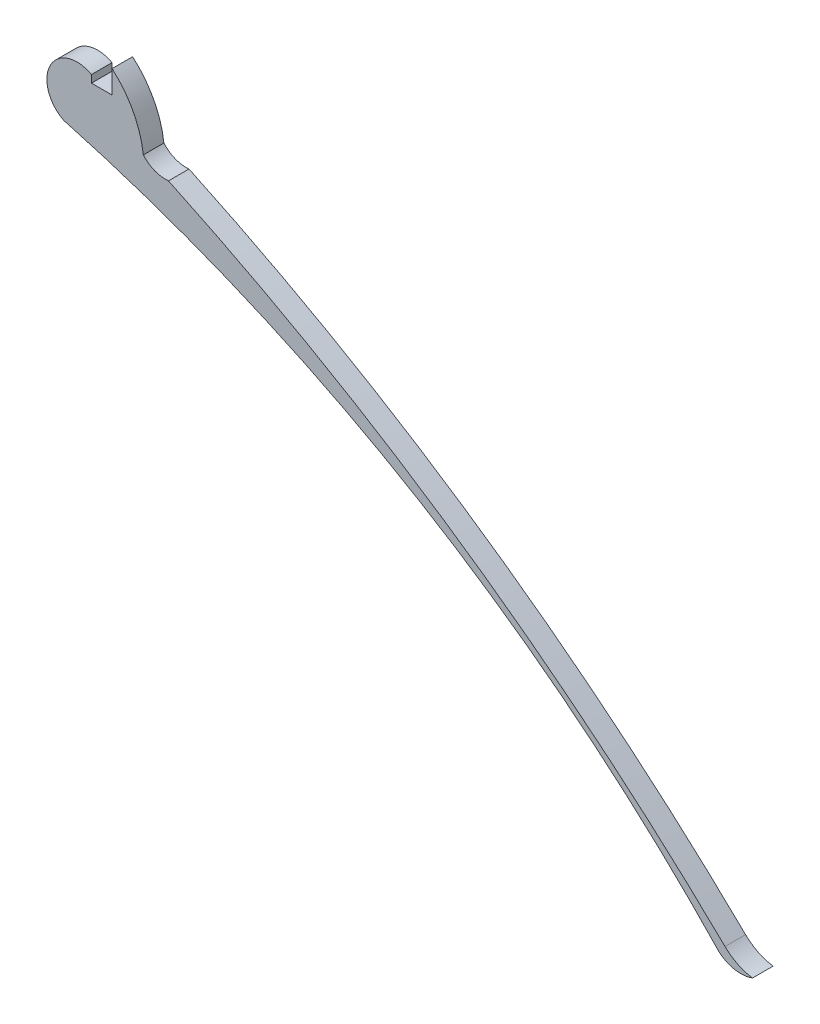
ISO-10303-21;
HEADER;
FILE_DESCRIPTION(('STEP AP214'),'2;1');
FILE_NAME('part.step','',(''),(''),'','','');
FILE_SCHEMA(('AUTOMOTIVE_DESIGN { 1 0 10303 214 1 1 1 1 }'));
ENDSEC;
DATA;
#1=APPLICATION_CONTEXT('core data for automotive mechanical design processes');
#2=APPLICATION_PROTOCOL_DEFINITION('international standard','automotive_design',2000,#1);
#3=PRODUCT_CONTEXT('',#1,'mechanical');
#4=PRODUCT('Part','Part','',(#3));
#5=PRODUCT_RELATED_PRODUCT_CATEGORY('part','',(#4));
#6=PRODUCT_DEFINITION_FORMATION('','',#4);
#7=PRODUCT_DEFINITION_CONTEXT('part definition',#1,'design');
#8=PRODUCT_DEFINITION('design','',#6,#7);
#9=PRODUCT_DEFINITION_SHAPE('','',#8);
#10=(LENGTH_UNIT() NAMED_UNIT(*) SI_UNIT(.MILLI.,.METRE.));
#11=(NAMED_UNIT(*) PLANE_ANGLE_UNIT() SI_UNIT($,.RADIAN.));
#12=(NAMED_UNIT(*) SI_UNIT($,.STERADIAN.) SOLID_ANGLE_UNIT());
#13=UNCERTAINTY_MEASURE_WITH_UNIT(LENGTH_MEASURE(1.E-05),#10,'distance_accuracy_value','');
#14=(GEOMETRIC_REPRESENTATION_CONTEXT(3) GLOBAL_UNCERTAINTY_ASSIGNED_CONTEXT((#13)) GLOBAL_UNIT_ASSIGNED_CONTEXT((#10,
#11,#12)) REPRESENTATION_CONTEXT('',''));
#15=CARTESIAN_POINT('',(0.,0.,0.));
#16=DIRECTION('',(0.,0.,1.));
#17=DIRECTION('',(1.,0.,0.));
#18=AXIS2_PLACEMENT_3D('',#15,#16,#17);
#19=CARTESIAN_POINT('',(1.28011584965684E-13,30.2380886688929,1.524));
#20=DIRECTION('',(1.,0.,0.));
#21=DIRECTION('',(0.,1.,0.));
#22=AXIS2_PLACEMENT_3D('',#19,#20,#21);
#23=PLANE('',#22);
#24=DIRECTION('',(0.,-1.,0.));
#25=VECTOR('',#24,1.);
#26=CARTESIAN_POINT('',(1.28011584965684E-13,30.2380886688929,0.));
#27=LINE('',#26,#25);
#28=CARTESIAN_POINT('',(1.45716771982052E-13,31.9367401571931,0.));
#29=VERTEX_POINT('',#28);
#30=CARTESIAN_POINT('',(1.28011584965684E-13,30.2380886688929,0.));
#31=VERTEX_POINT('',#30);
#32=EDGE_CURVE('E141',#29,#31,#27,.T.);
#33=ORIENTED_EDGE('',*,*,#32,.T.);
#34=DIRECTION('',(0.,0.,-1.));
#35=VECTOR('',#34,1.);
#36=CARTESIAN_POINT('',(1.28011584965684E-13,30.2380886688929,1.524));
#37=LINE('',#36,#35);
#38=CARTESIAN_POINT('',(1.28011584965684E-13,30.2380886688929,1.524));
#39=VERTEX_POINT('',#38);
#40=EDGE_CURVE('E11',#39,#31,#37,.T.);
#41=ORIENTED_EDGE('',*,*,#40,.F.);
#42=DIRECTION('',(0.,-1.,0.));
#43=VECTOR('',#42,1.);
#44=CARTESIAN_POINT('',(1.28011584965684E-13,30.2380886688929,1.524));
#45=LINE('',#44,#43);
#46=CARTESIAN_POINT('',(1.45716771982052E-13,31.9367401571931,1.524));
#47=VERTEX_POINT('',#46);
#48=EDGE_CURVE('E159',#47,#39,#45,.T.);
#49=ORIENTED_EDGE('',*,*,#48,.F.);
#50=DIRECTION('',(0.,0.,-1.));
#51=VECTOR('',#50,1.);
#52=CARTESIAN_POINT('',(1.45716771982052E-13,31.9367401571931,1.524));
#53=LINE('',#52,#51);
#54=EDGE_CURVE('E137',#47,#29,#53,.T.);
#55=ORIENTED_EDGE('',*,*,#54,.T.);
#56=EDGE_LOOP('',(#33,#41,#49,#55));
#57=FACE_BOUND('',#56,.T.);
#58=ADVANCED_FACE('F33',(#57),#23,.F.);
#59=CARTESIAN_POINT('',(1.28011584965684E-13,30.2380886688929,1.524));
#60=DIRECTION('',(0.,-1.,0.));
#61=DIRECTION('',(1.,0.,0.));
#62=AXIS2_PLACEMENT_3D('',#59,#60,#61);
#63=PLANE('',#62);
#64=DIRECTION('',(-1.,0.,0.));
#65=VECTOR('',#64,1.);
#66=CARTESIAN_POINT('',(1.28011584965684E-13,30.2380886688929,0.));
#67=LINE('',#66,#65);
#68=CARTESIAN_POINT('',(-1.52399999999987,30.2380886688929,0.));
#69=VERTEX_POINT('',#68);
#70=EDGE_CURVE('E144',#31,#69,#67,.T.);
#71=ORIENTED_EDGE('',*,*,#70,.T.);
#72=DIRECTION('',(0.,0.,-1.));
#73=VECTOR('',#72,1.);
#74=CARTESIAN_POINT('',(-1.52399999999987,30.2380886688929,1.524));
#75=LINE('',#74,#73);
#76=CARTESIAN_POINT('',(-1.52399999999987,30.2380886688929,1.524));
#77=VERTEX_POINT('',#76);
#78=EDGE_CURVE('E41',#77,#69,#75,.T.);
#79=ORIENTED_EDGE('',*,*,#78,.F.);
#80=DIRECTION('',(-1.,0.,0.));
#81=VECTOR('',#80,1.);
#82=CARTESIAN_POINT('',(1.28011584965684E-13,30.2380886688929,1.524));
#83=LINE('',#82,#81);
#84=EDGE_CURVE('E98',#39,#77,#83,.T.);
#85=ORIENTED_EDGE('',*,*,#84,.F.);
#86=ORIENTED_EDGE('',*,*,#40,.T.);
#87=EDGE_LOOP('',(#71,#79,#85,#86));
#88=FACE_BOUND('',#87,.T.);
#89=ADVANCED_FACE('F208',(#88),#63,.F.);
#90=CARTESIAN_POINT('',(-1.52399999999987,30.2380886688929,1.524));
#91=DIRECTION('',(-1.,0.,0.));
#92=DIRECTION('',(0.,0.,1.));
#93=AXIS2_PLACEMENT_3D('',#90,#91,#92);
#94=PLANE('',#93);
#95=DIRECTION('',(0.,1.,0.));
#96=VECTOR('',#95,1.);
#97=CARTESIAN_POINT('',(-1.52399999999987,30.2380886688929,0.));
#98=LINE('',#97,#96);
#99=CARTESIAN_POINT('',(-1.52399999999987,30.7906340648714,0.));
#100=VERTEX_POINT('',#99);
#101=EDGE_CURVE('E146',#69,#100,#98,.T.);
#102=ORIENTED_EDGE('',*,*,#101,.T.);
#103=DIRECTION('',(0.,0.,-1.));
#104=VECTOR('',#103,1.);
#105=CARTESIAN_POINT('',(-1.52399999999987,30.7906340648714,1.524));
#106=LINE('',#105,#104);
#107=CARTESIAN_POINT('',(-1.52399999999987,30.7906340648714,1.524));
#108=VERTEX_POINT('',#107);
#109=EDGE_CURVE('E172',#108,#100,#106,.T.);
#110=ORIENTED_EDGE('',*,*,#109,.F.);
#111=DIRECTION('',(0.,1.,0.));
#112=VECTOR('',#111,1.);
#113=CARTESIAN_POINT('',(-1.52399999999987,30.2380886688929,1.524));
#114=LINE('',#113,#112);
#115=EDGE_CURVE('E180',#77,#108,#114,.T.);
#116=ORIENTED_EDGE('',*,*,#115,.F.);
#117=ORIENTED_EDGE('',*,*,#78,.T.);
#118=EDGE_LOOP('',(#102,#110,#116,#117));
#119=FACE_BOUND('',#118,.T.);
#120=ADVANCED_FACE('F178',(#119),#94,.F.);
#121=CARTESIAN_POINT('',(-2.59236812445246,28.826727974569,1.524));
#122=DIRECTION('',(0.,0.,-1.));
#123=DIRECTION('',(-1.,0.,0.));
#124=AXIS2_PLACEMENT_3D('',#121,#122,#123);
#125=CYLINDRICAL_SURFACE('',#124,2.23569621837878);
#126=CARTESIAN_POINT('',(-2.59236812445246,28.826727974569,0.));
#127=DIRECTION('',(0.,0.,1.));
#128=DIRECTION('',(1.,0.,0.));
#129=AXIS2_PLACEMENT_3D('',#126,#127,#128);
#130=CIRCLE('',#129,2.23569621837878);
#131=CARTESIAN_POINT('',(-3.57441986085405,26.8182678759104,0.));
#132=VERTEX_POINT('',#131);
#133=EDGE_CURVE('E148',#100,#132,#130,.T.);
#134=ORIENTED_EDGE('',*,*,#133,.T.);
#135=DIRECTION('',(0.,0.,-1.));
#136=VECTOR('',#135,1.);
#137=CARTESIAN_POINT('',(-3.57441986085405,26.8182678759104,1.524));
#138=LINE('',#137,#136);
#139=CARTESIAN_POINT('',(-3.57441986085405,26.8182678759104,1.524));
#140=VERTEX_POINT('',#139);
#141=EDGE_CURVE('E169',#140,#132,#138,.T.);
#142=ORIENTED_EDGE('',*,*,#141,.F.);
#143=CARTESIAN_POINT('',(-2.59236812445246,28.826727974569,1.524));
#144=DIRECTION('',(0.,0.,1.));
#145=DIRECTION('',(1.,0.,0.));
#146=AXIS2_PLACEMENT_3D('',#143,#144,#145);
#147=CIRCLE('',#146,2.23569621837878);
#148=EDGE_CURVE('E198',#108,#140,#147,.T.);
#149=ORIENTED_EDGE('',*,*,#148,.F.);
#150=ORIENTED_EDGE('',*,*,#109,.T.);
#151=EDGE_LOOP('',(#134,#142,#149,#150));
#152=FACE_BOUND('',#151,.T.);
#153=ADVANCED_FACE('F189',(#152),#125,.T.);
#154=CARTESIAN_POINT('',(-31.1448342729283,-74.3023158685658,1.524));
#155=DIRECTION('',(0.,0.,-1.));
#156=DIRECTION('',(-1.,0.,0.));
#157=AXIS2_PLACEMENT_3D('',#154,#155,#156);
#158=CYLINDRICAL_SURFACE('',#157,104.811736974812);
#159=CARTESIAN_POINT('',(-31.1448342729283,-74.3023158685658,0.));
#160=DIRECTION('',(0.,0.,-1.));
#161=DIRECTION('',(-1.,0.,0.));
#162=AXIS2_PLACEMENT_3D('',#159,#160,#161);
#163=CIRCLE('',#162,104.811736974812);
#164=CARTESIAN_POINT('',(45.0105063883478,-2.28937052925812,0.));
#165=VERTEX_POINT('',#164);
#166=EDGE_CURVE('E150',#132,#165,#163,.T.);
#167=ORIENTED_EDGE('',*,*,#166,.T.);
#168=DIRECTION('',(0.,0.,-1.));
#169=VECTOR('',#168,1.);
#170=CARTESIAN_POINT('',(45.0105063883478,-2.28937052925812,1.524));
#171=LINE('',#170,#169);
#172=CARTESIAN_POINT('',(45.0105063883478,-2.28937052925812,1.524));
#173=VERTEX_POINT('',#172);
#174=EDGE_CURVE('E166',#173,#165,#171,.T.);
#175=ORIENTED_EDGE('',*,*,#174,.F.);
#176=CARTESIAN_POINT('',(-31.1448342729283,-74.3023158685658,1.524));
#177=DIRECTION('',(0.,0.,-1.));
#178=DIRECTION('',(-1.,0.,0.));
#179=AXIS2_PLACEMENT_3D('',#176,#177,#178);
#180=CIRCLE('',#179,104.811736974812);
#181=EDGE_CURVE('E195',#140,#173,#180,.T.);
#182=ORIENTED_EDGE('',*,*,#181,.F.);
#183=ORIENTED_EDGE('',*,*,#141,.T.);
#184=EDGE_LOOP('',(#167,#175,#182,#183));
#185=FACE_BOUND('',#184,.T.);
#186=ADVANCED_FACE('F193',(#185),#158,.F.);
#187=CARTESIAN_POINT('',(46.5948012816096,-0.368317483019987,1.524));
#188=DIRECTION('',(0.,0.,-1.));
#189=DIRECTION('',(-1.,0.,0.));
#190=AXIS2_PLACEMENT_3D('',#187,#188,#189);
#191=CYLINDRICAL_SURFACE('',#190,2.49006729131494);
#192=CARTESIAN_POINT('',(46.5948012816096,-0.368317483019987,0.));
#193=DIRECTION('',(0.,0.,1.));
#194=DIRECTION('',(1.,0.,0.));
#195=AXIS2_PLACEMENT_3D('',#192,#193,#194);
#196=CIRCLE('',#195,2.49006729131494);
#197=CARTESIAN_POINT('',(47.4679886521982,-2.70026493764265,0.));
#198=VERTEX_POINT('',#197);
#199=EDGE_CURVE('E152',#165,#198,#196,.T.);
#200=ORIENTED_EDGE('',*,*,#199,.T.);
#201=DIRECTION('',(0.,0.,-1.));
#202=VECTOR('',#201,1.);
#203=CARTESIAN_POINT('',(47.4679886521982,-2.70026493764265,1.524));
#204=LINE('',#203,#202);
#205=CARTESIAN_POINT('',(47.4679886521982,-2.70026493764265,1.524));
#206=VERTEX_POINT('',#205);
#207=EDGE_CURVE('E163',#206,#198,#204,.T.);
#208=ORIENTED_EDGE('',*,*,#207,.F.);
#209=CARTESIAN_POINT('',(46.5948012816096,-0.368317483019987,1.524));
#210=DIRECTION('',(0.,0.,1.));
#211=DIRECTION('',(1.,0.,0.));
#212=AXIS2_PLACEMENT_3D('',#209,#210,#211);
#213=CIRCLE('',#212,2.49006729131494);
#214=EDGE_CURVE('E197',#173,#206,#213,.T.);
#215=ORIENTED_EDGE('',*,*,#214,.F.);
#216=ORIENTED_EDGE('',*,*,#174,.T.);
#217=EDGE_LOOP('',(#200,#208,#215,#216));
#218=FACE_BOUND('',#217,.T.);
#219=ADVANCED_FACE('F220',(#218),#191,.T.);
#220=CARTESIAN_POINT('',(47.9793373193038,0.920985656755935,1.524));
#221=DIRECTION('',(0.,0.,-1.));
#222=DIRECTION('',(-1.,0.,0.));
#223=AXIS2_PLACEMENT_3D('',#220,#221,#222);
#224=CYLINDRICAL_SURFACE('',#223,3.65717559419599);
#225=CARTESIAN_POINT('',(47.9793373193038,0.920985656755935,0.));
#226=DIRECTION('',(0.,0.,-1.));
#227=DIRECTION('',(1.,0.,0.));
#228=AXIS2_PLACEMENT_3D('',#225,#226,#227);
#229=CIRCLE('',#228,3.65717559419599);
#230=CARTESIAN_POINT('',(45.4278466153785,-1.69909611955664,0.));
#231=VERTEX_POINT('',#230);
#232=EDGE_CURVE('E154',#198,#231,#229,.T.);
#233=ORIENTED_EDGE('',*,*,#232,.T.);
#234=DIRECTION('',(0.,0.,-1.));
#235=VECTOR('',#234,1.);
#236=CARTESIAN_POINT('',(45.4278466153785,-1.69909611955664,1.524));
#237=LINE('',#236,#235);
#238=CARTESIAN_POINT('',(45.4278466153785,-1.69909611955664,1.524));
#239=VERTEX_POINT('',#238);
#240=EDGE_CURVE('E132',#239,#231,#237,.T.);
#241=ORIENTED_EDGE('',*,*,#240,.F.);
#242=CARTESIAN_POINT('',(47.9793373193038,0.920985656755935,1.524));
#243=DIRECTION('',(0.,0.,-1.));
#244=DIRECTION('',(1.,0.,0.));
#245=AXIS2_PLACEMENT_3D('',#242,#243,#244);
#246=CIRCLE('',#245,3.65717559419599);
#247=EDGE_CURVE('E123',#206,#239,#246,.T.);
#248=ORIENTED_EDGE('',*,*,#247,.F.);
#249=ORIENTED_EDGE('',*,*,#207,.T.);
#250=EDGE_LOOP('',(#233,#241,#248,#249));
#251=FACE_BOUND('',#250,.T.);
#252=ADVANCED_FACE('F223',(#251),#224,.F.);
#253=CARTESIAN_POINT('',(-59.6697882039815,-109.622043790941,1.524));
#254=DIRECTION('',(0.,0.,-1.));
#255=DIRECTION('',(-1.,0.,0.));
#256=AXIS2_PLACEMENT_3D('',#253,#254,#255);
#257=CYLINDRICAL_SURFACE('',#256,150.641546323396);
#258=CARTESIAN_POINT('',(-59.6697882039815,-109.622043790941,0.));
#259=DIRECTION('',(0.,0.,1.));
#260=DIRECTION('',(-1.,0.,0.));
#261=AXIS2_PLACEMENT_3D('',#258,#259,#260);
#262=CIRCLE('',#261,150.641546323396);
#263=CARTESIAN_POINT('',(4.18095048365143,26.8182678759104,0.));
#264=VERTEX_POINT('',#263);
#265=EDGE_CURVE('E131',#231,#264,#262,.T.);
#266=ORIENTED_EDGE('',*,*,#265,.T.);
#267=DIRECTION('',(0.,0.,-1.));
#268=VECTOR('',#267,1.);
#269=CARTESIAN_POINT('',(4.18095048365143,26.8182678759104,1.524));
#270=LINE('',#269,#268);
#271=CARTESIAN_POINT('',(4.18095048365143,26.8182678759104,1.524));
#272=VERTEX_POINT('',#271);
#273=EDGE_CURVE('E128',#272,#264,#270,.T.);
#274=ORIENTED_EDGE('',*,*,#273,.F.);
#275=CARTESIAN_POINT('',(-59.6697882039815,-109.622043790941,1.524));
#276=DIRECTION('',(0.,0.,1.));
#277=DIRECTION('',(-1.,0.,0.));
#278=AXIS2_PLACEMENT_3D('',#275,#276,#277);
#279=CIRCLE('',#278,150.641546323396);
#280=EDGE_CURVE('E117',#239,#272,#279,.T.);
#281=ORIENTED_EDGE('',*,*,#280,.F.);
#282=ORIENTED_EDGE('',*,*,#240,.T.);
#283=EDGE_LOOP('',(#266,#274,#281,#282));
#284=FACE_BOUND('',#283,.T.);
#285=ADVANCED_FACE('F129',(#284),#257,.T.);
#286=CARTESIAN_POINT('',(3.95733942534834,28.9760550660895,1.524));
#287=DIRECTION('',(0.,0.,-1.));
#288=DIRECTION('',(-1.,0.,0.));
#289=AXIS2_PLACEMENT_3D('',#286,#287,#288);
#290=CYLINDRICAL_SURFACE('',#289,2.16934263395542);
#291=CARTESIAN_POINT('',(3.95733942534834,28.9760550660895,0.));
#292=DIRECTION('',(0.,0.,-1.));
#293=DIRECTION('',(1.,0.,0.));
#294=AXIS2_PLACEMENT_3D('',#291,#292,#293);
#295=CIRCLE('',#294,2.16934263395542);
#296=CARTESIAN_POINT('',(2.31849111315155,27.5547093399882,0.));
#297=VERTEX_POINT('',#296);
#298=EDGE_CURVE('E84',#264,#297,#295,.T.);
#299=ORIENTED_EDGE('',*,*,#298,.T.);
#300=DIRECTION('',(0.,0.,-1.));
#301=VECTOR('',#300,1.);
#302=CARTESIAN_POINT('',(2.31849111315155,27.5547093399882,1.524));
#303=LINE('',#302,#301);
#304=CARTESIAN_POINT('',(2.31849111315155,27.5547093399882,1.524));
#305=VERTEX_POINT('',#304);
#306=EDGE_CURVE('E133',#305,#297,#303,.T.);
#307=ORIENTED_EDGE('',*,*,#306,.F.);
#308=CARTESIAN_POINT('',(3.95733942534834,28.9760550660895,1.524));
#309=DIRECTION('',(0.,0.,-1.));
#310=DIRECTION('',(1.,0.,0.));
#311=AXIS2_PLACEMENT_3D('',#308,#309,#310);
#312=CIRCLE('',#311,2.16934263395542);
#313=EDGE_CURVE('E121',#272,#305,#312,.T.);
#314=ORIENTED_EDGE('',*,*,#313,.F.);
#315=ORIENTED_EDGE('',*,*,#273,.T.);
#316=EDGE_LOOP('',(#299,#307,#314,#315));
#317=FACE_BOUND('',#316,.T.);
#318=ADVANCED_FACE('F135',(#317),#290,.F.);
#319=CARTESIAN_POINT('',(-4.50684252516602,26.7478510658513,1.524));
#320=DIRECTION('',(0.,0.,-1.));
#321=DIRECTION('',(-1.,0.,0.));
#322=AXIS2_PLACEMENT_3D('',#319,#320,#321);
#323=CYLINDRICAL_SURFACE('',#322,6.87285963401644);
#324=CARTESIAN_POINT('',(-4.50684252516602,26.7478510658513,0.));
#325=DIRECTION('',(0.,0.,1.));
#326=DIRECTION('',(-1.,0.,0.));
#327=AXIS2_PLACEMENT_3D('',#324,#325,#326);
#328=CIRCLE('',#327,6.87285963401644);
#329=EDGE_CURVE('E90',#297,#29,#328,.T.);
#330=ORIENTED_EDGE('',*,*,#329,.T.);
#331=ORIENTED_EDGE('',*,*,#54,.F.);
#332=CARTESIAN_POINT('',(-4.50684252516602,26.7478510658513,1.524));
#333=DIRECTION('',(0.,0.,1.));
#334=DIRECTION('',(-1.,0.,0.));
#335=AXIS2_PLACEMENT_3D('',#332,#333,#334);
#336=CIRCLE('',#335,6.87285963401644);
#337=EDGE_CURVE('E49',#305,#47,#336,.T.);
#338=ORIENTED_EDGE('',*,*,#337,.F.);
#339=ORIENTED_EDGE('',*,*,#306,.T.);
#340=EDGE_LOOP('',(#330,#331,#338,#339));
#341=FACE_BOUND('',#340,.T.);
#342=ADVANCED_FACE('F232',(#341),#323,.T.);
#343=CARTESIAN_POINT('',(-4.50684252516602,26.7478510658513,1.524));
#344=DIRECTION('',(0.,0.,-1.));
#345=DIRECTION('',(-1.,0.,0.));
#346=AXIS2_PLACEMENT_3D('',#343,#344,#345);
#347=PLANE('',#346);
#348=ORIENTED_EDGE('',*,*,#48,.T.);
#349=ORIENTED_EDGE('',*,*,#84,.T.);
#350=ORIENTED_EDGE('',*,*,#115,.T.);
#351=ORIENTED_EDGE('',*,*,#148,.T.);
#352=ORIENTED_EDGE('',*,*,#181,.T.);
#353=ORIENTED_EDGE('',*,*,#214,.T.);
#354=ORIENTED_EDGE('',*,*,#247,.T.);
#355=ORIENTED_EDGE('',*,*,#280,.T.);
#356=ORIENTED_EDGE('',*,*,#313,.T.);
#357=ORIENTED_EDGE('',*,*,#337,.T.);
#358=EDGE_LOOP('',(#348,#349,#350,#351,#352,#353,#354,#355,#356,#357));
#359=FACE_BOUND('',#358,.T.);
#360=ADVANCED_FACE('F119',(#359),#347,.F.);
#361=CARTESIAN_POINT('',(-4.50684252516602,26.7478510658513,0.));
#362=DIRECTION('',(0.,0.,-1.));
#363=DIRECTION('',(-1.,0.,0.));
#364=AXIS2_PLACEMENT_3D('',#361,#362,#363);
#365=PLANE('',#364);
#366=ORIENTED_EDGE('',*,*,#32,.F.);
#367=ORIENTED_EDGE('',*,*,#329,.F.);
#368=ORIENTED_EDGE('',*,*,#298,.F.);
#369=ORIENTED_EDGE('',*,*,#265,.F.);
#370=ORIENTED_EDGE('',*,*,#232,.F.);
#371=ORIENTED_EDGE('',*,*,#199,.F.);
#372=ORIENTED_EDGE('',*,*,#166,.F.);
#373=ORIENTED_EDGE('',*,*,#133,.F.);
#374=ORIENTED_EDGE('',*,*,#101,.F.);
#375=ORIENTED_EDGE('',*,*,#70,.F.);
#376=EDGE_LOOP('',(#366,#367,#368,#369,#370,#371,#372,#373,#374,#375));
#377=FACE_BOUND('',#376,.T.);
#378=ADVANCED_FACE('F184',(#377),#365,.T.);
#379=CLOSED_SHELL('',(#58,#89,#120,#153,#186,#219,#252,#285,#318,#342,#360,#378));
#380=MANIFOLD_SOLID_BREP('B2',#379);
#381=ADVANCED_BREP_SHAPE_REPRESENTATION('',(#18,#380),#14);
#382=SHAPE_DEFINITION_REPRESENTATION(#9,#381);
ENDSEC;
END-ISO-10303-21;
